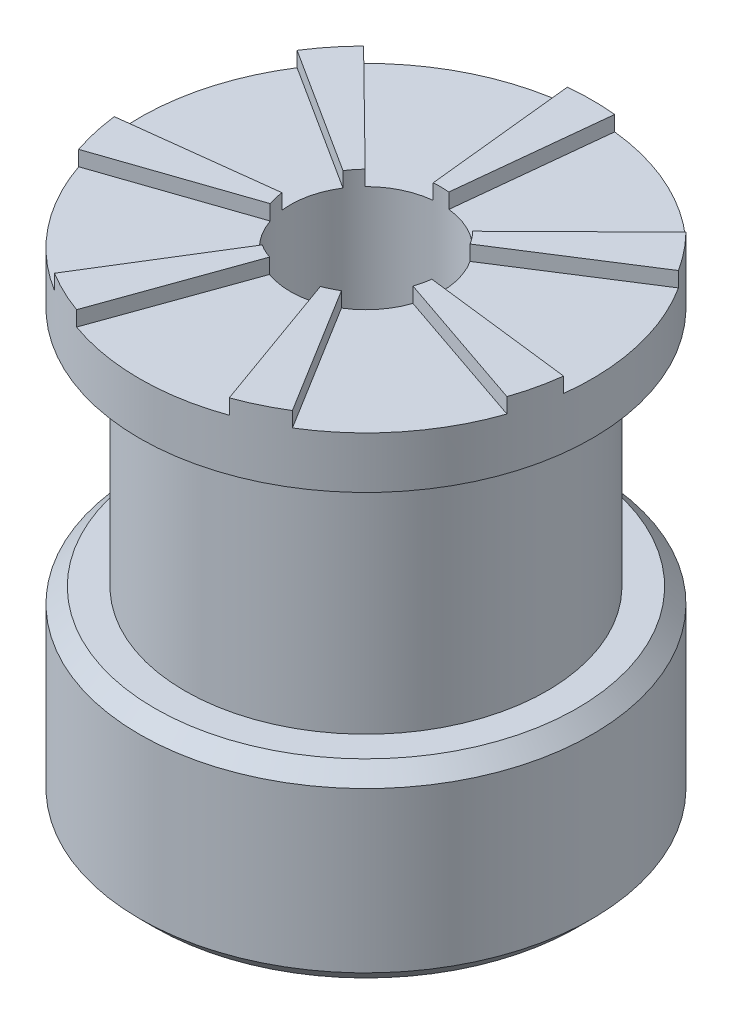
ISO-10303-21;
HEADER;
FILE_DESCRIPTION(('STEP AP214'),'2;1');
FILE_NAME('part.step','',(''),(''),'','','');
FILE_SCHEMA(('AUTOMOTIVE_DESIGN { 1 0 10303 214 1 1 1 1 }'));
ENDSEC;
DATA;
#1=APPLICATION_CONTEXT('core data for automotive mechanical design processes');
#2=APPLICATION_PROTOCOL_DEFINITION('international standard','automotive_design',2000,#1);
#3=PRODUCT_CONTEXT('',#1,'mechanical');
#4=PRODUCT('Part','Part','',(#3));
#5=PRODUCT_RELATED_PRODUCT_CATEGORY('part','',(#4));
#6=PRODUCT_DEFINITION_FORMATION('','',#4);
#7=PRODUCT_DEFINITION_CONTEXT('part definition',#1,'design');
#8=PRODUCT_DEFINITION('design','',#6,#7);
#9=PRODUCT_DEFINITION_SHAPE('','',#8);
#10=(LENGTH_UNIT() NAMED_UNIT(*) SI_UNIT(.MILLI.,.METRE.));
#11=(NAMED_UNIT(*) PLANE_ANGLE_UNIT() SI_UNIT($,.RADIAN.));
#12=(NAMED_UNIT(*) SI_UNIT($,.STERADIAN.) SOLID_ANGLE_UNIT());
#13=UNCERTAINTY_MEASURE_WITH_UNIT(LENGTH_MEASURE(1.E-05),#10,'distance_accuracy_value','');
#14=(GEOMETRIC_REPRESENTATION_CONTEXT(3) GLOBAL_UNCERTAINTY_ASSIGNED_CONTEXT((#13)) GLOBAL_UNIT_ASSIGNED_CONTEXT((#10,
#11,#12)) REPRESENTATION_CONTEXT('',''));
#15=CARTESIAN_POINT('',(0.,0.,0.));
#16=DIRECTION('',(0.,0.,1.));
#17=DIRECTION('',(1.,0.,0.));
#18=AXIS2_PLACEMENT_3D('',#15,#16,#17);
#19=CARTESIAN_POINT('',(0.,16.,0.));
#20=DIRECTION('',(0.,1.,0.));
#21=DIRECTION('',(0.,0.,1.));
#22=AXIS2_PLACEMENT_3D('',#19,#20,#21);
#23=PLANE('',#22);
#24=CARTESIAN_POINT('',(0.,16.,0.));
#25=DIRECTION('',(0.,1.,0.));
#26=DIRECTION('',(0.,0.,1.));
#27=AXIS2_PLACEMENT_3D('',#24,#25,#26);
#28=CIRCLE('',#27,2.5);
#29=CARTESIAN_POINT('',(1.78094024237836,16.,-1.75449475720998));
#30=VERTEX_POINT('',#29);
#31=CARTESIAN_POINT('',(0.261321158169134,16.,-2.48630473842068));
#32=VERTEX_POINT('',#31);
#33=EDGE_CURVE('E470',#30,#32,#28,.T.);
#34=ORIENTED_EDGE('',*,*,#33,.F.);
#35=DIRECTION('',(-0.712376096951347,0.,0.701797902883989));
#36=VECTOR('',#35,1.);
#37=CARTESIAN_POINT('',(0.,16.,0.));
#38=LINE('',#37,#36);
#39=CARTESIAN_POINT('',(5.3428207271351,16.,-5.26348427162992));
#40=VERTEX_POINT('',#39);
#41=EDGE_CURVE('E307',#40,#30,#38,.T.);
#42=ORIENTED_EDGE('',*,*,#41,.F.);
#43=CARTESIAN_POINT('',(0.,16.,0.));
#44=DIRECTION('',(0.,1.,0.));
#45=DIRECTION('',(0.,0.,1.));
#46=AXIS2_PLACEMENT_3D('',#43,#44,#45);
#47=CIRCLE('',#46,7.5);
#48=CARTESIAN_POINT('',(0.783963474507402,16.,-7.45891421526205));
#49=VERTEX_POINT('',#48);
#50=EDGE_CURVE('E468',#40,#49,#47,.T.);
#51=ORIENTED_EDGE('',*,*,#50,.T.);
#52=DIRECTION('',(-0.104528463267654,0.,0.994521895368273));
#53=VECTOR('',#52,1.);
#54=CARTESIAN_POINT('',(0.,16.,0.));
#55=LINE('',#54,#53);
#56=EDGE_CURVE('E435',#49,#32,#55,.T.);
#57=ORIENTED_EDGE('',*,*,#56,.T.);
#58=EDGE_LOOP('',(#34,#42,#51,#57));
#59=FACE_BOUND('',#58,.T.);
#60=ADVANCED_FACE('F94',(#59),#23,.T.);
#61=DIRECTION('',(-0.842720958654041,0.,0.53835061609068));
#62=VECTOR('',#61,1.);
#63=CARTESIAN_POINT('',(0.,16.,0.));
#64=LINE('',#63,#62);
#65=CARTESIAN_POINT('',(6.3204071899053,16.,-4.0376296206801));
#66=VERTEX_POINT('',#65);
#67=CARTESIAN_POINT('',(2.1068023966351,16.,-1.34587654022671));
#68=VERTEX_POINT('',#67);
#69=EDGE_CURVE('E288',#66,#68,#64,.T.);
#70=ORIENTED_EDGE('',*,*,#69,.T.);
#71=CARTESIAN_POINT('',(2.48211731585459,16.,0.298485561350611));
#72=VERTEX_POINT('',#71);
#73=EDGE_CURVE('E585',#72,#68,#28,.T.);
#74=ORIENTED_EDGE('',*,*,#73,.F.);
#75=DIRECTION('',(-0.992846926341837,0.,-0.11939422454025));
#76=VECTOR('',#75,1.);
#77=CARTESIAN_POINT('',(0.,16.,0.));
#78=LINE('',#77,#76);
#79=CARTESIAN_POINT('',(7.44635194756378,16.,0.89545668405186));
#80=VERTEX_POINT('',#79);
#81=EDGE_CURVE('E322',#80,#72,#78,.T.);
#82=ORIENTED_EDGE('',*,*,#81,.F.);
#83=EDGE_CURVE('E596',#80,#66,#47,.T.);
#84=ORIENTED_EDGE('',*,*,#83,.T.);
#85=EDGE_LOOP('',(#70,#74,#82,#84));
#86=FACE_BOUND('',#85,.T.);
#87=ADVANCED_FACE('F526',(#86),#23,.T.);
#88=DIRECTION('',(-0.946327383799164,0.,-0.323209657454461));
#89=VECTOR('',#88,1.);
#90=CARTESIAN_POINT('',(0.,16.,0.));
#91=LINE('',#90,#89);
#92=CARTESIAN_POINT('',(7.09745537849372,16.,2.42407243090848));
#93=VERTEX_POINT('',#92);
#94=CARTESIAN_POINT('',(2.3658184594979,16.,0.808024143636173));
#95=VERTEX_POINT('',#94);
#96=EDGE_CURVE('E292',#93,#95,#91,.T.);
#97=ORIENTED_EDGE('',*,*,#96,.T.);
#98=CARTESIAN_POINT('',(1.31420942452626,16.,2.12670016421835));
#99=VERTEX_POINT('',#98);
#100=EDGE_CURVE('E581',#99,#95,#28,.T.);
#101=ORIENTED_EDGE('',*,*,#100,.F.);
#102=DIRECTION('',(-0.525683769810498,0.,-0.850680065687344));
#103=VECTOR('',#102,1.);
#104=CARTESIAN_POINT('',(0.,16.,0.));
#105=LINE('',#104,#103);
#106=CARTESIAN_POINT('',(3.94262827357875,16.,6.38010049265507));
#107=VERTEX_POINT('',#106);
#108=EDGE_CURVE('E343',#107,#99,#105,.T.);
#109=ORIENTED_EDGE('',*,*,#108,.F.);
#110=EDGE_CURVE('E597',#107,#93,#47,.T.);
#111=ORIENTED_EDGE('',*,*,#110,.T.);
#112=EDGE_LOOP('',(#97,#101,#109,#111));
#113=FACE_BOUND('',#112,.T.);
#114=ADVANCED_FACE('F532',(#113),#23,.T.);
#115=DIRECTION('',(-0.337329987382822,0.,-0.941386466660906));
#116=VECTOR('',#115,1.);
#117=CARTESIAN_POINT('',(0.,16.,0.));
#118=LINE('',#117,#116);
#119=CARTESIAN_POINT('',(2.52997490537118,16.,7.06039849995679));
#120=VERTEX_POINT('',#119);
#121=CARTESIAN_POINT('',(0.843324968457075,16.,2.35346616665226));
#122=VERTEX_POINT('',#121);
#123=EDGE_CURVE('E338',#120,#122,#118,.T.);
#124=ORIENTED_EDGE('',*,*,#123,.T.);
#125=CARTESIAN_POINT('',(-0.843324968457075,16.,2.35346616665226));
#126=VERTEX_POINT('',#125);
#127=EDGE_CURVE('E577',#126,#122,#28,.T.);
#128=ORIENTED_EDGE('',*,*,#127,.F.);
#129=DIRECTION('',(0.337329987382841,0.,-0.941386466660899));
#130=VECTOR('',#129,1.);
#131=CARTESIAN_POINT('',(0.,16.,0.));
#132=LINE('',#131,#130);
#133=CARTESIAN_POINT('',(-2.52997490537128,16.,7.06039849995675));
#134=VERTEX_POINT('',#133);
#135=EDGE_CURVE('E366',#134,#126,#132,.T.);
#136=ORIENTED_EDGE('',*,*,#135,.F.);
#137=EDGE_CURVE('E600',#134,#120,#47,.T.);
#138=ORIENTED_EDGE('',*,*,#137,.T.);
#139=EDGE_LOOP('',(#124,#128,#136,#138));
#140=FACE_BOUND('',#139,.T.);
#141=ADVANCED_FACE('F638',(#140),#23,.T.);
#142=DIRECTION('',(0.525683769810515,0.,-0.850680065687333));
#143=VECTOR('',#142,1.);
#144=CARTESIAN_POINT('',(0.,16.,0.));
#145=LINE('',#144,#143);
#146=CARTESIAN_POINT('',(-3.94262827357884,16.,6.38010049265501));
#147=VERTEX_POINT('',#146);
#148=CARTESIAN_POINT('',(-1.31420942452626,16.,2.12670016421835));
#149=VERTEX_POINT('',#148);
#150=EDGE_CURVE('E361',#147,#149,#145,.T.);
#151=ORIENTED_EDGE('',*,*,#150,.T.);
#152=CARTESIAN_POINT('',(-2.36581845949791,16.,0.808024143636149));
#153=VERTEX_POINT('',#152);
#154=EDGE_CURVE('E575',#153,#149,#28,.T.);
#155=ORIENTED_EDGE('',*,*,#154,.F.);
#156=DIRECTION('',(0.946327383799169,0.,-0.323209657454447));
#157=VECTOR('',#156,1.);
#158=CARTESIAN_POINT('',(0.,16.,0.));
#159=LINE('',#158,#157);
#160=CARTESIAN_POINT('',(-7.09745537849375,16.,2.42407243090838));
#161=VERTEX_POINT('',#160);
#162=EDGE_CURVE('E389',#161,#153,#159,.T.);
#163=ORIENTED_EDGE('',*,*,#162,.F.);
#164=EDGE_CURVE('E605',#161,#147,#47,.T.);
#165=ORIENTED_EDGE('',*,*,#164,.T.);
#166=EDGE_LOOP('',(#151,#155,#163,#165));
#167=FACE_BOUND('',#166,.T.);
#168=ADVANCED_FACE('F544',(#167),#23,.T.);
#169=DIRECTION('',(0.992846926341838,0.,-0.119394224540235));
#170=VECTOR('',#169,1.);
#171=CARTESIAN_POINT('',(0.,16.,0.));
#172=LINE('',#171,#170);
#173=CARTESIAN_POINT('',(-7.44635194756379,16.,0.89545668405176));
#174=VERTEX_POINT('',#173);
#175=CARTESIAN_POINT('',(-2.4821173158546,16.,0.298485561350587));
#176=VERTEX_POINT('',#175);
#177=EDGE_CURVE('E384',#174,#176,#172,.T.);
#178=ORIENTED_EDGE('',*,*,#177,.T.);
#179=CARTESIAN_POINT('',(-2.1068023966351,16.,-1.34587654022671));
#180=VERTEX_POINT('',#179);
#181=EDGE_CURVE('E469',#180,#176,#28,.T.);
#182=ORIENTED_EDGE('',*,*,#181,.F.);
#183=DIRECTION('',(0.842720958654029,0.,0.538350616090698));
#184=VECTOR('',#183,1.);
#185=CARTESIAN_POINT('',(0.,16.,0.));
#186=LINE('',#185,#184);
#187=CARTESIAN_POINT('',(-6.32040718990524,16.,-4.0376296206802));
#188=VERTEX_POINT('',#187);
#189=EDGE_CURVE('E412',#188,#180,#186,.T.);
#190=ORIENTED_EDGE('',*,*,#189,.F.);
#191=EDGE_CURVE('E478',#188,#174,#47,.T.);
#192=ORIENTED_EDGE('',*,*,#191,.T.);
#193=EDGE_LOOP('',(#178,#182,#190,#192));
#194=FACE_BOUND('',#193,.T.);
#195=ADVANCED_FACE('F538',(#194),#23,.T.);
#196=DIRECTION('',(0.712376096951332,0.,0.701797902884004));
#197=VECTOR('',#196,1.);
#198=CARTESIAN_POINT('',(0.,16.,0.));
#199=LINE('',#198,#197);
#200=CARTESIAN_POINT('',(-5.34282072713502,16.,-5.26348427163));
#201=VERTEX_POINT('',#200);
#202=CARTESIAN_POINT('',(-1.78094024237836,16.,-1.75449475720998));
#203=VERTEX_POINT('',#202);
#204=EDGE_CURVE('E407',#201,#203,#199,.T.);
#205=ORIENTED_EDGE('',*,*,#204,.T.);
#206=CARTESIAN_POINT('',(-0.261321158169134,16.,-2.48630473842068));
#207=VERTEX_POINT('',#206);
#208=EDGE_CURVE('E465',#207,#203,#28,.T.);
#209=ORIENTED_EDGE('',*,*,#208,.F.);
#210=DIRECTION('',(0.104528463267654,0.,0.994521895368273));
#211=VECTOR('',#210,1.);
#212=CARTESIAN_POINT('',(0.,16.,0.));
#213=LINE('',#212,#211);
#214=CARTESIAN_POINT('',(-0.783963474507402,16.,-7.45891421526205));
#215=VERTEX_POINT('',#214);
#216=EDGE_CURVE('E430',#215,#207,#213,.T.);
#217=ORIENTED_EDGE('',*,*,#216,.F.);
#218=EDGE_CURVE('E474',#215,#201,#47,.T.);
#219=ORIENTED_EDGE('',*,*,#218,.T.);
#220=EDGE_LOOP('',(#205,#209,#217,#219));
#221=FACE_BOUND('',#220,.T.);
#222=ADVANCED_FACE('F500',(#221),#23,.T.);
#223=CARTESIAN_POINT('',(0.,16.,0.));
#224=DIRECTION('',(0.,-1.,0.));
#225=DIRECTION('',(0.,0.,-1.));
#226=AXIS2_PLACEMENT_3D('',#223,#224,#225);
#227=CYLINDRICAL_SURFACE('',#226,7.5);
#228=CARTESIAN_POINT('',(0.,0.5,0.));
#229=DIRECTION('',(0.,1.,0.));
#230=DIRECTION('',(0.,0.,1.));
#231=AXIS2_PLACEMENT_3D('',#228,#229,#230);
#232=CIRCLE('',#231,7.5);
#233=CARTESIAN_POINT('',(0.,0.5,7.5));
#234=VERTEX_POINT('',#233);
#235=EDGE_CURVE('E483',#234,#234,#232,.T.);
#236=ORIENTED_EDGE('',*,*,#235,.T.);
#237=EDGE_LOOP('',(#236));
#238=FACE_BOUND('',#237,.T.);
#239=CARTESIAN_POINT('',(0.,5.79,0.));
#240=DIRECTION('',(0.,1.,0.));
#241=DIRECTION('',(0.,0.,1.));
#242=AXIS2_PLACEMENT_3D('',#239,#240,#241);
#243=CIRCLE('',#242,7.5);
#244=CARTESIAN_POINT('',(0.,5.79,7.5));
#245=VERTEX_POINT('',#244);
#246=EDGE_CURVE('E477',#245,#245,#243,.F.);
#247=ORIENTED_EDGE('',*,*,#246,.T.);
#248=EDGE_LOOP('',(#247));
#249=FACE_BOUND('',#248,.T.);
#250=ADVANCED_FACE('F497',(#238,#249),#227,.T.);
#251=CARTESIAN_POINT('',(0.,0.,0.));
#252=DIRECTION('',(0.,1.,0.));
#253=DIRECTION('',(0.,0.,1.));
#254=AXIS2_PLACEMENT_3D('',#251,#252,#253);
#255=PLANE('',#254);
#256=CARTESIAN_POINT('',(0.,0.,0.));
#257=DIRECTION('',(0.,1.,0.));
#258=DIRECTION('',(0.,0.,1.));
#259=AXIS2_PLACEMENT_3D('',#256,#257,#258);
#260=CIRCLE('',#259,7.);
#261=CARTESIAN_POINT('',(0.,0.,7.));
#262=VERTEX_POINT('',#261);
#263=EDGE_CURVE('E103',#262,#262,#260,.F.);
#264=ORIENTED_EDGE('',*,*,#263,.T.);
#265=EDGE_LOOP('',(#264));
#266=FACE_BOUND('',#265,.T.);
#267=CARTESIAN_POINT('',(0.,0.,0.));
#268=DIRECTION('',(0.,1.,0.));
#269=DIRECTION('',(0.,0.,1.));
#270=AXIS2_PLACEMENT_3D('',#267,#268,#269);
#271=CIRCLE('',#270,2.5);
#272=CARTESIAN_POINT('',(0.,0.,2.5));
#273=VERTEX_POINT('',#272);
#274=EDGE_CURVE('E471',#273,#273,#271,.T.);
#275=ORIENTED_EDGE('',*,*,#274,.T.);
#276=EDGE_LOOP('',(#275));
#277=FACE_BOUND('',#276,.T.);
#278=ADVANCED_FACE('F488',(#266,#277),#255,.F.);
#279=CARTESIAN_POINT('',(0.,14.29,0.));
#280=DIRECTION('',(0.,1.,0.));
#281=DIRECTION('',(0.,0.,1.));
#282=AXIS2_PLACEMENT_3D('',#279,#280,#281);
#283=CIRCLE('',#282,7.5);
#284=CARTESIAN_POINT('',(0.,14.29,7.5));
#285=VERTEX_POINT('',#284);
#286=EDGE_CURVE('E462',#285,#285,#283,.T.);
#287=ORIENTED_EDGE('',*,*,#286,.T.);
#288=EDGE_LOOP('',(#287));
#289=FACE_BOUND('',#288,.T.);
#290=ORIENTED_EDGE('',*,*,#218,.F.);
#291=DIRECTION('',(0.,-1.,0.));
#292=VECTOR('',#291,1.);
#293=CARTESIAN_POINT('',(-0.783963474507402,16.5,-7.45891421526205));
#294=LINE('',#293,#292);
#295=CARTESIAN_POINT('',(-0.783963474507402,16.5,-7.45891421526205));
#296=VERTEX_POINT('',#295);
#297=EDGE_CURVE('E455',#296,#215,#294,.T.);
#298=ORIENTED_EDGE('',*,*,#297,.F.);
#299=CARTESIAN_POINT('',(0.,16.5,0.));
#300=DIRECTION('',(0.,1.,0.));
#301=DIRECTION('',(0.,0.,1.));
#302=AXIS2_PLACEMENT_3D('',#299,#300,#301);
#303=CIRCLE('',#302,7.5);
#304=CARTESIAN_POINT('',(0.783963474507402,16.5,-7.45891421526205));
#305=VERTEX_POINT('',#304);
#306=EDGE_CURVE('E431',#305,#296,#303,.T.);
#307=ORIENTED_EDGE('',*,*,#306,.F.);
#308=DIRECTION('',(0.,-1.,0.));
#309=VECTOR('',#308,1.);
#310=CARTESIAN_POINT('',(0.783963474507402,16.5,-7.45891421526205));
#311=LINE('',#310,#309);
#312=EDGE_CURVE('E442',#305,#49,#311,.T.);
#313=ORIENTED_EDGE('',*,*,#312,.T.);
#314=ORIENTED_EDGE('',*,*,#50,.F.);
#315=DIRECTION('',(0.,-1.,0.));
#316=VECTOR('',#315,1.);
#317=CARTESIAN_POINT('',(5.3428207271351,16.5,-5.26348427162992));
#318=LINE('',#317,#316);
#319=CARTESIAN_POINT('',(5.3428207271351,16.5,-5.26348427162992));
#320=VERTEX_POINT('',#319);
#321=EDGE_CURVE('E293',#320,#40,#318,.T.);
#322=ORIENTED_EDGE('',*,*,#321,.F.);
#323=CARTESIAN_POINT('',(0.,16.5,0.));
#324=DIRECTION('',(0.,1.,0.));
#325=DIRECTION('',(0.,0.,1.));
#326=AXIS2_PLACEMENT_3D('',#323,#324,#325);
#327=CIRCLE('',#326,7.5);
#328=CARTESIAN_POINT('',(6.3204071899053,16.5,-4.0376296206801));
#329=VERTEX_POINT('',#328);
#330=EDGE_CURVE('E296',#329,#320,#327,.T.);
#331=ORIENTED_EDGE('',*,*,#330,.F.);
#332=DIRECTION('',(0.,-1.,0.));
#333=VECTOR('',#332,1.);
#334=CARTESIAN_POINT('',(6.3204071899053,16.5,-4.0376296206801));
#335=LINE('',#334,#333);
#336=EDGE_CURVE('E282',#329,#66,#335,.T.);
#337=ORIENTED_EDGE('',*,*,#336,.T.);
#338=ORIENTED_EDGE('',*,*,#83,.F.);
#339=DIRECTION('',(0.,-1.,0.));
#340=VECTOR('',#339,1.);
#341=CARTESIAN_POINT('',(7.44635194756378,16.5,0.89545668405186));
#342=LINE('',#341,#340);
#343=CARTESIAN_POINT('',(7.44635194756378,16.5,0.89545668405186));
#344=VERTEX_POINT('',#343);
#345=EDGE_CURVE('E334',#344,#80,#342,.T.);
#346=ORIENTED_EDGE('',*,*,#345,.F.);
#347=CARTESIAN_POINT('',(0.,16.5,0.));
#348=DIRECTION('',(0.,1.,0.));
#349=DIRECTION('',(0.,0.,1.));
#350=AXIS2_PLACEMENT_3D('',#347,#348,#349);
#351=CIRCLE('',#350,7.5);
#352=CARTESIAN_POINT('',(7.09745537849372,16.5,2.42407243090848));
#353=VERTEX_POINT('',#352);
#354=EDGE_CURVE('E321',#353,#344,#351,.T.);
#355=ORIENTED_EDGE('',*,*,#354,.F.);
#356=DIRECTION('',(0.,-1.,0.));
#357=VECTOR('',#356,1.);
#358=CARTESIAN_POINT('',(7.09745537849372,16.5,2.42407243090848));
#359=LINE('',#358,#357);
#360=EDGE_CURVE('E336',#353,#93,#359,.T.);
#361=ORIENTED_EDGE('',*,*,#360,.T.);
#362=ORIENTED_EDGE('',*,*,#110,.F.);
#363=DIRECTION('',(0.,-1.,0.));
#364=VECTOR('',#363,1.);
#365=CARTESIAN_POINT('',(3.94262827357875,16.5,6.38010049265507));
#366=LINE('',#365,#364);
#367=CARTESIAN_POINT('',(3.94262827357875,16.5,6.38010049265507));
#368=VERTEX_POINT('',#367);
#369=EDGE_CURVE('E357',#368,#107,#366,.T.);
#370=ORIENTED_EDGE('',*,*,#369,.F.);
#371=CARTESIAN_POINT('',(0.,16.5,0.));
#372=DIRECTION('',(0.,1.,0.));
#373=DIRECTION('',(0.,0.,1.));
#374=AXIS2_PLACEMENT_3D('',#371,#372,#373);
#375=CIRCLE('',#374,7.5);
#376=CARTESIAN_POINT('',(2.52997490537118,16.5,7.06039849995679));
#377=VERTEX_POINT('',#376);
#378=EDGE_CURVE('E342',#377,#368,#375,.T.);
#379=ORIENTED_EDGE('',*,*,#378,.F.);
#380=DIRECTION('',(0.,-1.,0.));
#381=VECTOR('',#380,1.);
#382=CARTESIAN_POINT('',(2.52997490537118,16.5,7.06039849995679));
#383=LINE('',#382,#381);
#384=EDGE_CURVE('E359',#377,#120,#383,.T.);
#385=ORIENTED_EDGE('',*,*,#384,.T.);
#386=ORIENTED_EDGE('',*,*,#137,.F.);
#387=DIRECTION('',(0.,-1.,0.));
#388=VECTOR('',#387,1.);
#389=CARTESIAN_POINT('',(-2.52997490537128,16.5,7.06039849995675));
#390=LINE('',#389,#388);
#391=CARTESIAN_POINT('',(-2.52997490537128,16.5,7.06039849995675));
#392=VERTEX_POINT('',#391);
#393=EDGE_CURVE('E380',#392,#134,#390,.T.);
#394=ORIENTED_EDGE('',*,*,#393,.F.);
#395=CARTESIAN_POINT('',(0.,16.5,0.));
#396=DIRECTION('',(0.,1.,0.));
#397=DIRECTION('',(0.,0.,1.));
#398=AXIS2_PLACEMENT_3D('',#395,#396,#397);
#399=CIRCLE('',#398,7.5);
#400=CARTESIAN_POINT('',(-3.94262827357884,16.5,6.38010049265501));
#401=VERTEX_POINT('',#400);
#402=EDGE_CURVE('E365',#401,#392,#399,.T.);
#403=ORIENTED_EDGE('',*,*,#402,.F.);
#404=DIRECTION('',(0.,-1.,0.));
#405=VECTOR('',#404,1.);
#406=CARTESIAN_POINT('',(-3.94262827357884,16.5,6.38010049265501));
#407=LINE('',#406,#405);
#408=EDGE_CURVE('E382',#401,#147,#407,.T.);
#409=ORIENTED_EDGE('',*,*,#408,.T.);
#410=ORIENTED_EDGE('',*,*,#164,.F.);
#411=DIRECTION('',(0.,-1.,0.));
#412=VECTOR('',#411,1.);
#413=CARTESIAN_POINT('',(-7.09745537849375,16.5,2.42407243090838));
#414=LINE('',#413,#412);
#415=CARTESIAN_POINT('',(-7.09745537849375,16.5,2.42407243090838));
#416=VERTEX_POINT('',#415);
#417=EDGE_CURVE('E403',#416,#161,#414,.T.);
#418=ORIENTED_EDGE('',*,*,#417,.F.);
#419=CARTESIAN_POINT('',(0.,16.5,0.));
#420=DIRECTION('',(0.,1.,0.));
#421=DIRECTION('',(0.,0.,1.));
#422=AXIS2_PLACEMENT_3D('',#419,#420,#421);
#423=CIRCLE('',#422,7.5);
#424=CARTESIAN_POINT('',(-7.44635194756379,16.5,0.89545668405176));
#425=VERTEX_POINT('',#424);
#426=EDGE_CURVE('E388',#425,#416,#423,.T.);
#427=ORIENTED_EDGE('',*,*,#426,.F.);
#428=DIRECTION('',(0.,-1.,0.));
#429=VECTOR('',#428,1.);
#430=CARTESIAN_POINT('',(-7.44635194756379,16.5,0.89545668405176));
#431=LINE('',#430,#429);
#432=EDGE_CURVE('E405',#425,#174,#431,.T.);
#433=ORIENTED_EDGE('',*,*,#432,.T.);
#434=ORIENTED_EDGE('',*,*,#191,.F.);
#435=DIRECTION('',(0.,-1.,0.));
#436=VECTOR('',#435,1.);
#437=CARTESIAN_POINT('',(-6.32040718990524,16.5,-4.0376296206802));
#438=LINE('',#437,#436);
#439=CARTESIAN_POINT('',(-6.32040718990524,16.5,-4.0376296206802));
#440=VERTEX_POINT('',#439);
#441=EDGE_CURVE('E426',#440,#188,#438,.T.);
#442=ORIENTED_EDGE('',*,*,#441,.F.);
#443=CARTESIAN_POINT('',(0.,16.5,0.));
#444=DIRECTION('',(0.,1.,0.));
#445=DIRECTION('',(0.,0.,1.));
#446=AXIS2_PLACEMENT_3D('',#443,#444,#445);
#447=CIRCLE('',#446,7.5);
#448=CARTESIAN_POINT('',(-5.34282072713502,16.5,-5.26348427163));
#449=VERTEX_POINT('',#448);
#450=EDGE_CURVE('E411',#449,#440,#447,.T.);
#451=ORIENTED_EDGE('',*,*,#450,.F.);
#452=DIRECTION('',(0.,-1.,0.));
#453=VECTOR('',#452,1.);
#454=CARTESIAN_POINT('',(-5.34282072713502,16.5,-5.26348427163));
#455=LINE('',#454,#453);
#456=EDGE_CURVE('E428',#449,#201,#455,.T.);
#457=ORIENTED_EDGE('',*,*,#456,.T.);
#458=EDGE_LOOP('',(#290,#298,#307,#313,#314,#322,#331,#337,#338,#346,#355,#361,#362,#370,#379,
#385,#386,#394,#403,#409,#410,#418,#427,#433,#434,#442,#451,#457));
#459=FACE_BOUND('',#458,.T.);
#460=ADVANCED_FACE('F298',(#289,#459),#227,.T.);
#461=CARTESIAN_POINT('',(0.,16.,0.));
#462=DIRECTION('',(0.,-1.,0.));
#463=DIRECTION('',(0.,0.,-1.));
#464=AXIS2_PLACEMENT_3D('',#461,#462,#463);
#465=CYLINDRICAL_SURFACE('',#464,2.5);
#466=ORIENTED_EDGE('',*,*,#208,.T.);
#467=DIRECTION('',(0.,-1.,0.));
#468=VECTOR('',#467,1.);
#469=CARTESIAN_POINT('',(-1.78094024237836,16.5,-1.75449475720998));
#470=LINE('',#469,#468);
#471=CARTESIAN_POINT('',(-1.78094024237836,16.5,-1.75449475720998));
#472=VERTEX_POINT('',#471);
#473=EDGE_CURVE('E418',#472,#203,#470,.T.);
#474=ORIENTED_EDGE('',*,*,#473,.F.);
#475=CARTESIAN_POINT('',(0.,16.5,0.));
#476=DIRECTION('',(0.,1.,0.));
#477=DIRECTION('',(0.,0.,1.));
#478=AXIS2_PLACEMENT_3D('',#475,#476,#477);
#479=CIRCLE('',#478,2.5);
#480=CARTESIAN_POINT('',(-2.1068023966351,16.5,-1.34587654022671));
#481=VERTEX_POINT('',#480);
#482=EDGE_CURVE('E416',#481,#472,#479,.F.);
#483=ORIENTED_EDGE('',*,*,#482,.F.);
#484=DIRECTION('',(0.,-1.,0.));
#485=VECTOR('',#484,1.);
#486=CARTESIAN_POINT('',(-2.1068023966351,16.5,-1.34587654022671));
#487=LINE('',#486,#485);
#488=EDGE_CURVE('E424',#481,#180,#487,.T.);
#489=ORIENTED_EDGE('',*,*,#488,.T.);
#490=ORIENTED_EDGE('',*,*,#181,.T.);
#491=DIRECTION('',(0.,-1.,0.));
#492=VECTOR('',#491,1.);
#493=CARTESIAN_POINT('',(-2.4821173158546,16.5,0.298485561350587));
#494=LINE('',#493,#492);
#495=CARTESIAN_POINT('',(-2.4821173158546,16.5,0.298485561350587));
#496=VERTEX_POINT('',#495);
#497=EDGE_CURVE('E395',#496,#176,#494,.T.);
#498=ORIENTED_EDGE('',*,*,#497,.F.);
#499=CARTESIAN_POINT('',(0.,16.5,0.));
#500=DIRECTION('',(0.,1.,0.));
#501=DIRECTION('',(0.,0.,1.));
#502=AXIS2_PLACEMENT_3D('',#499,#500,#501);
#503=CIRCLE('',#502,2.5);
#504=CARTESIAN_POINT('',(-2.36581845949791,16.5,0.808024143636149));
#505=VERTEX_POINT('',#504);
#506=EDGE_CURVE('E393',#505,#496,#503,.F.);
#507=ORIENTED_EDGE('',*,*,#506,.F.);
#508=DIRECTION('',(0.,-1.,0.));
#509=VECTOR('',#508,1.);
#510=CARTESIAN_POINT('',(-2.36581845949791,16.5,0.808024143636149));
#511=LINE('',#510,#509);
#512=EDGE_CURVE('E401',#505,#153,#511,.T.);
#513=ORIENTED_EDGE('',*,*,#512,.T.);
#514=ORIENTED_EDGE('',*,*,#154,.T.);
#515=DIRECTION('',(0.,-1.,0.));
#516=VECTOR('',#515,1.);
#517=CARTESIAN_POINT('',(-1.31420942452626,16.5,2.12670016421835));
#518=LINE('',#517,#516);
#519=CARTESIAN_POINT('',(-1.31420942452626,16.5,2.12670016421835));
#520=VERTEX_POINT('',#519);
#521=EDGE_CURVE('E372',#520,#149,#518,.T.);
#522=ORIENTED_EDGE('',*,*,#521,.F.);
#523=CARTESIAN_POINT('',(0.,16.5,0.));
#524=DIRECTION('',(0.,1.,0.));
#525=DIRECTION('',(0.,0.,1.));
#526=AXIS2_PLACEMENT_3D('',#523,#524,#525);
#527=CIRCLE('',#526,2.5);
#528=CARTESIAN_POINT('',(-0.843324968457075,16.5,2.35346616665226));
#529=VERTEX_POINT('',#528);
#530=EDGE_CURVE('E370',#529,#520,#527,.F.);
#531=ORIENTED_EDGE('',*,*,#530,.F.);
#532=DIRECTION('',(0.,-1.,0.));
#533=VECTOR('',#532,1.);
#534=CARTESIAN_POINT('',(-0.843324968457075,16.5,2.35346616665226));
#535=LINE('',#534,#533);
#536=EDGE_CURVE('E378',#529,#126,#535,.T.);
#537=ORIENTED_EDGE('',*,*,#536,.T.);
#538=ORIENTED_EDGE('',*,*,#127,.T.);
#539=DIRECTION('',(0.,-1.,0.));
#540=VECTOR('',#539,1.);
#541=CARTESIAN_POINT('',(0.843324968457075,16.5,2.35346616665226));
#542=LINE('',#541,#540);
#543=CARTESIAN_POINT('',(0.843324968457075,16.5,2.35346616665226));
#544=VERTEX_POINT('',#543);
#545=EDGE_CURVE('E349',#544,#122,#542,.T.);
#546=ORIENTED_EDGE('',*,*,#545,.F.);
#547=CARTESIAN_POINT('',(0.,16.5,0.));
#548=DIRECTION('',(0.,1.,0.));
#549=DIRECTION('',(0.,0.,1.));
#550=AXIS2_PLACEMENT_3D('',#547,#548,#549);
#551=CIRCLE('',#550,2.5);
#552=CARTESIAN_POINT('',(1.31420942452626,16.5,2.12670016421835));
#553=VERTEX_POINT('',#552);
#554=EDGE_CURVE('E347',#553,#544,#551,.F.);
#555=ORIENTED_EDGE('',*,*,#554,.F.);
#556=DIRECTION('',(0.,-1.,0.));
#557=VECTOR('',#556,1.);
#558=CARTESIAN_POINT('',(1.31420942452626,16.5,2.12670016421835));
#559=LINE('',#558,#557);
#560=EDGE_CURVE('E355',#553,#99,#559,.T.);
#561=ORIENTED_EDGE('',*,*,#560,.T.);
#562=ORIENTED_EDGE('',*,*,#100,.T.);
#563=DIRECTION('',(0.,-1.,0.));
#564=VECTOR('',#563,1.);
#565=CARTESIAN_POINT('',(2.3658184594979,16.5,0.808024143636173));
#566=LINE('',#565,#564);
#567=CARTESIAN_POINT('',(2.3658184594979,16.5,0.808024143636173));
#568=VERTEX_POINT('',#567);
#569=EDGE_CURVE('E328',#568,#95,#566,.T.);
#570=ORIENTED_EDGE('',*,*,#569,.F.);
#571=CARTESIAN_POINT('',(0.,16.5,0.));
#572=DIRECTION('',(0.,1.,0.));
#573=DIRECTION('',(0.,0.,1.));
#574=AXIS2_PLACEMENT_3D('',#571,#572,#573);
#575=CIRCLE('',#574,2.5);
#576=CARTESIAN_POINT('',(2.48211731585459,16.5,0.298485561350611));
#577=VERTEX_POINT('',#576);
#578=EDGE_CURVE('E326',#577,#568,#575,.F.);
#579=ORIENTED_EDGE('',*,*,#578,.F.);
#580=DIRECTION('',(0.,-1.,0.));
#581=VECTOR('',#580,1.);
#582=CARTESIAN_POINT('',(2.48211731585459,16.5,0.298485561350611));
#583=LINE('',#582,#581);
#584=EDGE_CURVE('E117',#577,#72,#583,.T.);
#585=ORIENTED_EDGE('',*,*,#584,.T.);
#586=ORIENTED_EDGE('',*,*,#73,.T.);
#587=DIRECTION('',(0.,-1.,0.));
#588=VECTOR('',#587,1.);
#589=CARTESIAN_POINT('',(2.1068023966351,16.5,-1.34587654022671));
#590=LINE('',#589,#588);
#591=CARTESIAN_POINT('',(2.1068023966351,16.5,-1.34587654022671));
#592=VERTEX_POINT('',#591);
#593=EDGE_CURVE('E313',#592,#68,#590,.T.);
#594=ORIENTED_EDGE('',*,*,#593,.F.);
#595=CARTESIAN_POINT('',(0.,16.5,0.));
#596=DIRECTION('',(0.,1.,0.));
#597=DIRECTION('',(0.,0.,1.));
#598=AXIS2_PLACEMENT_3D('',#595,#596,#597);
#599=CIRCLE('',#598,2.5);
#600=CARTESIAN_POINT('',(1.78094024237836,16.5,-1.75449475720998));
#601=VERTEX_POINT('',#600);
#602=EDGE_CURVE('E305',#601,#592,#599,.F.);
#603=ORIENTED_EDGE('',*,*,#602,.F.);
#604=DIRECTION('',(0.,-1.,0.));
#605=VECTOR('',#604,1.);
#606=CARTESIAN_POINT('',(1.78094024237836,16.5,-1.75449475720998));
#607=LINE('',#606,#605);
#608=EDGE_CURVE('E110',#601,#30,#607,.T.);
#609=ORIENTED_EDGE('',*,*,#608,.T.);
#610=ORIENTED_EDGE('',*,*,#33,.T.);
#611=DIRECTION('',(0.,-1.,0.));
#612=VECTOR('',#611,1.);
#613=CARTESIAN_POINT('',(0.261321158169134,16.5,-2.48630473842068));
#614=LINE('',#613,#612);
#615=CARTESIAN_POINT('',(0.261321158169134,16.5,-2.48630473842068));
#616=VERTEX_POINT('',#615);
#617=EDGE_CURVE('E449',#616,#32,#614,.T.);
#618=ORIENTED_EDGE('',*,*,#617,.F.);
#619=CARTESIAN_POINT('',(0.,16.5,0.));
#620=DIRECTION('',(0.,1.,0.));
#621=DIRECTION('',(0.,0.,1.));
#622=AXIS2_PLACEMENT_3D('',#619,#620,#621);
#623=CIRCLE('',#622,2.5);
#624=CARTESIAN_POINT('',(-0.261321158169134,16.5,-2.48630473842068));
#625=VERTEX_POINT('',#624);
#626=EDGE_CURVE('E437',#625,#616,#623,.F.);
#627=ORIENTED_EDGE('',*,*,#626,.F.);
#628=DIRECTION('',(0.,-1.,0.));
#629=VECTOR('',#628,1.);
#630=CARTESIAN_POINT('',(-0.261321158169134,16.5,-2.48630473842068));
#631=LINE('',#630,#629);
#632=EDGE_CURVE('E452',#625,#207,#631,.T.);
#633=ORIENTED_EDGE('',*,*,#632,.T.);
#634=EDGE_LOOP('',(#466,#474,#483,#489,#490,#498,#507,#513,#514,#522,#531,#537,#538,#546,#555,
#561,#562,#570,#579,#585,#586,#594,#603,#609,#610,#618,#627,#633));
#635=FACE_BOUND('',#634,.T.);
#636=ORIENTED_EDGE('',*,*,#274,.F.);
#637=EDGE_LOOP('',(#636));
#638=FACE_BOUND('',#637,.T.);
#639=ADVANCED_FACE('F549',(#635,#638),#465,.F.);
#640=CARTESIAN_POINT('',(0.,14.29,0.));
#641=DIRECTION('',(0.,1.,0.));
#642=DIRECTION('',(0.,0.,1.));
#643=AXIS2_PLACEMENT_3D('',#640,#641,#642);
#644=PLANE('',#643);
#645=CARTESIAN_POINT('',(0.,14.29,0.));
#646=DIRECTION('',(0.,1.,0.));
#647=DIRECTION('',(0.,0.,1.));
#648=AXIS2_PLACEMENT_3D('',#645,#646,#647);
#649=CIRCLE('',#648,6.);
#650=CARTESIAN_POINT('',(0.,14.29,6.));
#651=VERTEX_POINT('',#650);
#652=EDGE_CURVE('E459',#651,#651,#649,.T.);
#653=ORIENTED_EDGE('',*,*,#652,.T.);
#654=EDGE_LOOP('',(#653));
#655=FACE_BOUND('',#654,.T.);
#656=ORIENTED_EDGE('',*,*,#286,.F.);
#657=EDGE_LOOP('',(#656));
#658=FACE_BOUND('',#657,.T.);
#659=ADVANCED_FACE('F512',(#655,#658),#644,.F.);
#660=CARTESIAN_POINT('',(0.,6.29,0.));
#661=DIRECTION('',(0.,1.,0.));
#662=DIRECTION('',(0.,0.,1.));
#663=AXIS2_PLACEMENT_3D('',#660,#661,#662);
#664=PLANE('',#663);
#665=CARTESIAN_POINT('',(0.,6.29,0.));
#666=DIRECTION('',(0.,1.,0.));
#667=DIRECTION('',(0.,0.,1.));
#668=AXIS2_PLACEMENT_3D('',#665,#666,#667);
#669=CIRCLE('',#668,7.);
#670=CARTESIAN_POINT('',(0.,6.29,7.));
#671=VERTEX_POINT('',#670);
#672=EDGE_CURVE('E13',#671,#671,#669,.T.);
#673=ORIENTED_EDGE('',*,*,#672,.T.);
#674=EDGE_LOOP('',(#673));
#675=FACE_BOUND('',#674,.T.);
#676=CARTESIAN_POINT('',(0.,6.29,0.));
#677=DIRECTION('',(0.,1.,0.));
#678=DIRECTION('',(0.,0.,1.));
#679=AXIS2_PLACEMENT_3D('',#676,#677,#678);
#680=CIRCLE('',#679,6.);
#681=CARTESIAN_POINT('',(0.,6.29,6.));
#682=VERTEX_POINT('',#681);
#683=EDGE_CURVE('E458',#682,#682,#680,.T.);
#684=ORIENTED_EDGE('',*,*,#683,.F.);
#685=EDGE_LOOP('',(#684));
#686=FACE_BOUND('',#685,.T.);
#687=ADVANCED_FACE('F509',(#675,#686),#664,.T.);
#688=CARTESIAN_POINT('',(0.,14.29,0.));
#689=DIRECTION('',(0.,-1.,0.));
#690=DIRECTION('',(0.,0.,-1.));
#691=AXIS2_PLACEMENT_3D('',#688,#689,#690);
#692=CYLINDRICAL_SURFACE('',#691,6.);
#693=ORIENTED_EDGE('',*,*,#652,.F.);
#694=EDGE_LOOP('',(#693));
#695=FACE_BOUND('',#694,.T.);
#696=ORIENTED_EDGE('',*,*,#683,.T.);
#697=EDGE_LOOP('',(#696));
#698=FACE_BOUND('',#697,.T.);
#699=ADVANCED_FACE('F494',(#695,#698),#692,.T.);
#700=CARTESIAN_POINT('',(0.,0.5,0.));
#701=DIRECTION('',(0.,1.,0.));
#702=DIRECTION('',(0.,0.,1.));
#703=AXIS2_PLACEMENT_3D('',#700,#701,#702);
#704=CONICAL_SURFACE('',#703,7.5,0.785398163397447);
#705=ORIENTED_EDGE('',*,*,#263,.F.);
#706=EDGE_LOOP('',(#705));
#707=FACE_BOUND('',#706,.T.);
#708=ORIENTED_EDGE('',*,*,#235,.F.);
#709=EDGE_LOOP('',(#708));
#710=FACE_BOUND('',#709,.T.);
#711=ADVANCED_FACE('F491',(#707,#710),#704,.T.);
#712=CARTESIAN_POINT('',(0.,6.29,0.));
#713=DIRECTION('',(0.,-1.,0.));
#714=DIRECTION('',(0.,0.,-1.));
#715=AXIS2_PLACEMENT_3D('',#712,#713,#714);
#716=CONICAL_SURFACE('',#715,7.,0.785398163397444);
#717=ORIENTED_EDGE('',*,*,#246,.F.);
#718=EDGE_LOOP('',(#717));
#719=FACE_BOUND('',#718,.T.);
#720=ORIENTED_EDGE('',*,*,#672,.F.);
#721=EDGE_LOOP('',(#720));
#722=FACE_BOUND('',#721,.T.);
#723=ADVANCED_FACE('F97',(#719,#722),#716,.T.);
#724=CARTESIAN_POINT('',(0.,16.5,0.));
#725=DIRECTION('',(0.994521895368273,0.,-0.104528463267654));
#726=DIRECTION('',(-0.104528463267654,0.,-0.994521895368273));
#727=AXIS2_PLACEMENT_3D('',#724,#725,#726);
#728=PLANE('',#727);
#729=ORIENTED_EDGE('',*,*,#216,.T.);
#730=ORIENTED_EDGE('',*,*,#632,.F.);
#731=DIRECTION('',(0.104528463267654,0.,0.994521895368273));
#732=VECTOR('',#731,1.);
#733=CARTESIAN_POINT('',(0.,16.5,0.));
#734=LINE('',#733,#732);
#735=EDGE_CURVE('E434',#296,#625,#734,.T.);
#736=ORIENTED_EDGE('',*,*,#735,.F.);
#737=ORIENTED_EDGE('',*,*,#297,.T.);
#738=EDGE_LOOP('',(#729,#730,#736,#737));
#739=FACE_BOUND('',#738,.T.);
#740=ADVANCED_FACE('F506',(#739),#728,.F.);
#741=CARTESIAN_POINT('',(0.,16.5,0.));
#742=DIRECTION('',(0.994521895368273,0.,0.104528463267654));
#743=DIRECTION('',(0.104528463267654,0.,-0.994521895368273));
#744=AXIS2_PLACEMENT_3D('',#741,#742,#743);
#745=PLANE('',#744);
#746=ORIENTED_EDGE('',*,*,#56,.F.);
#747=ORIENTED_EDGE('',*,*,#312,.F.);
#748=DIRECTION('',(-0.104528463267654,0.,0.994521895368273));
#749=VECTOR('',#748,1.);
#750=CARTESIAN_POINT('',(0.,16.5,0.));
#751=LINE('',#750,#749);
#752=EDGE_CURVE('E439',#305,#616,#751,.T.);
#753=ORIENTED_EDGE('',*,*,#752,.T.);
#754=ORIENTED_EDGE('',*,*,#617,.T.);
#755=EDGE_LOOP('',(#746,#747,#753,#754));
#756=FACE_BOUND('',#755,.T.);
#757=ADVANCED_FACE('F592',(#756),#745,.T.);
#758=CARTESIAN_POINT('',(0.,16.5,0.));
#759=DIRECTION('',(0.,1.,0.));
#760=DIRECTION('',(0.,0.,1.));
#761=AXIS2_PLACEMENT_3D('',#758,#759,#760);
#762=PLANE('',#761);
#763=ORIENTED_EDGE('',*,*,#306,.T.);
#764=ORIENTED_EDGE('',*,*,#735,.T.);
#765=ORIENTED_EDGE('',*,*,#626,.T.);
#766=ORIENTED_EDGE('',*,*,#752,.F.);
#767=EDGE_LOOP('',(#763,#764,#765,#766));
#768=FACE_BOUND('',#767,.T.);
#769=ADVANCED_FACE('F595',(#768),#762,.T.);
#770=CARTESIAN_POINT('',(0.,16.5,0.));
#771=DIRECTION('',(0.701797902884004,0.,-0.712376096951332));
#772=DIRECTION('',(-0.712376096951332,0.,-0.701797902884004));
#773=AXIS2_PLACEMENT_3D('',#770,#771,#772);
#774=PLANE('',#773);
#775=ORIENTED_EDGE('',*,*,#204,.F.);
#776=ORIENTED_EDGE('',*,*,#456,.F.);
#777=DIRECTION('',(0.712376096951332,0.,0.701797902884004));
#778=VECTOR('',#777,1.);
#779=CARTESIAN_POINT('',(0.,16.5,0.));
#780=LINE('',#779,#778);
#781=EDGE_CURVE('E408',#449,#472,#780,.T.);
#782=ORIENTED_EDGE('',*,*,#781,.T.);
#783=ORIENTED_EDGE('',*,*,#473,.T.);
#784=EDGE_LOOP('',(#775,#776,#782,#783));
#785=FACE_BOUND('',#784,.T.);
#786=ADVANCED_FACE('F561',(#785),#774,.T.);
#787=CARTESIAN_POINT('',(0.,16.5,0.));
#788=DIRECTION('',(0.538350616090698,0.,-0.842720958654029));
#789=DIRECTION('',(-0.842720958654029,0.,-0.538350616090698));
#790=AXIS2_PLACEMENT_3D('',#787,#788,#789);
#791=PLANE('',#790);
#792=ORIENTED_EDGE('',*,*,#189,.T.);
#793=ORIENTED_EDGE('',*,*,#488,.F.);
#794=DIRECTION('',(0.842720958654029,0.,0.538350616090698));
#795=VECTOR('',#794,1.);
#796=CARTESIAN_POINT('',(0.,16.5,0.));
#797=LINE('',#796,#795);
#798=EDGE_CURVE('E414',#440,#481,#797,.T.);
#799=ORIENTED_EDGE('',*,*,#798,.F.);
#800=ORIENTED_EDGE('',*,*,#441,.T.);
#801=EDGE_LOOP('',(#792,#793,#799,#800));
#802=FACE_BOUND('',#801,.T.);
#803=ADVANCED_FACE('F571',(#802),#791,.F.);
#804=CARTESIAN_POINT('',(0.,16.5,0.));
#805=DIRECTION('',(0.,1.,0.));
#806=DIRECTION('',(0.,0.,1.));
#807=AXIS2_PLACEMENT_3D('',#804,#805,#806);
#808=PLANE('',#807);
#809=ORIENTED_EDGE('',*,*,#781,.F.);
#810=ORIENTED_EDGE('',*,*,#450,.T.);
#811=ORIENTED_EDGE('',*,*,#798,.T.);
#812=ORIENTED_EDGE('',*,*,#482,.T.);
#813=EDGE_LOOP('',(#809,#810,#811,#812));
#814=FACE_BOUND('',#813,.T.);
#815=ADVANCED_FACE('F563',(#814),#808,.T.);
#816=CARTESIAN_POINT('',(0.,16.5,0.));
#817=DIRECTION('',(-0.119394224540235,0.,-0.992846926341838));
#818=DIRECTION('',(-0.992846926341838,0.,0.119394224540235));
#819=AXIS2_PLACEMENT_3D('',#816,#817,#818);
#820=PLANE('',#819);
#821=ORIENTED_EDGE('',*,*,#177,.F.);
#822=ORIENTED_EDGE('',*,*,#432,.F.);
#823=DIRECTION('',(0.992846926341838,0.,-0.119394224540235));
#824=VECTOR('',#823,1.);
#825=CARTESIAN_POINT('',(0.,16.5,0.));
#826=LINE('',#825,#824);
#827=EDGE_CURVE('E385',#425,#496,#826,.T.);
#828=ORIENTED_EDGE('',*,*,#827,.T.);
#829=ORIENTED_EDGE('',*,*,#497,.T.);
#830=EDGE_LOOP('',(#821,#822,#828,#829));
#831=FACE_BOUND('',#830,.T.);
#832=ADVANCED_FACE('F617',(#831),#820,.T.);
#833=CARTESIAN_POINT('',(0.,16.5,0.));
#834=DIRECTION('',(-0.323209657454447,0.,-0.946327383799169));
#835=DIRECTION('',(-0.946327383799169,0.,0.323209657454447));
#836=AXIS2_PLACEMENT_3D('',#833,#834,#835);
#837=PLANE('',#836);
#838=ORIENTED_EDGE('',*,*,#162,.T.);
#839=ORIENTED_EDGE('',*,*,#512,.F.);
#840=DIRECTION('',(0.946327383799169,0.,-0.323209657454447));
#841=VECTOR('',#840,1.);
#842=CARTESIAN_POINT('',(0.,16.5,0.));
#843=LINE('',#842,#841);
#844=EDGE_CURVE('E391',#416,#505,#843,.T.);
#845=ORIENTED_EDGE('',*,*,#844,.F.);
#846=ORIENTED_EDGE('',*,*,#417,.T.);
#847=EDGE_LOOP('',(#838,#839,#845,#846));
#848=FACE_BOUND('',#847,.T.);
#849=ADVANCED_FACE('F624',(#848),#837,.F.);
#850=CARTESIAN_POINT('',(0.,16.5,0.));
#851=DIRECTION('',(0.,1.,0.));
#852=DIRECTION('',(0.,0.,1.));
#853=AXIS2_PLACEMENT_3D('',#850,#851,#852);
#854=PLANE('',#853);
#855=ORIENTED_EDGE('',*,*,#827,.F.);
#856=ORIENTED_EDGE('',*,*,#426,.T.);
#857=ORIENTED_EDGE('',*,*,#844,.T.);
#858=ORIENTED_EDGE('',*,*,#506,.T.);
#859=EDGE_LOOP('',(#855,#856,#857,#858));
#860=FACE_BOUND('',#859,.T.);
#861=ADVANCED_FACE('F621',(#860),#854,.T.);
#862=CARTESIAN_POINT('',(0.,16.5,0.));
#863=DIRECTION('',(-0.850680065687333,0.,-0.525683769810515));
#864=DIRECTION('',(-0.525683769810515,0.,0.850680065687333));
#865=AXIS2_PLACEMENT_3D('',#862,#863,#864);
#866=PLANE('',#865);
#867=ORIENTED_EDGE('',*,*,#150,.F.);
#868=ORIENTED_EDGE('',*,*,#408,.F.);
#869=DIRECTION('',(0.525683769810515,0.,-0.850680065687333));
#870=VECTOR('',#869,1.);
#871=CARTESIAN_POINT('',(0.,16.5,0.));
#872=LINE('',#871,#870);
#873=EDGE_CURVE('E362',#401,#520,#872,.T.);
#874=ORIENTED_EDGE('',*,*,#873,.T.);
#875=ORIENTED_EDGE('',*,*,#521,.T.);
#876=EDGE_LOOP('',(#867,#868,#874,#875));
#877=FACE_BOUND('',#876,.T.);
#878=ADVANCED_FACE('F627',(#877),#866,.T.);
#879=CARTESIAN_POINT('',(0.,16.5,0.));
#880=DIRECTION('',(-0.941386466660899,0.,-0.337329987382841));
#881=DIRECTION('',(-0.337329987382841,0.,0.941386466660899));
#882=AXIS2_PLACEMENT_3D('',#879,#880,#881);
#883=PLANE('',#882);
#884=ORIENTED_EDGE('',*,*,#135,.T.);
#885=ORIENTED_EDGE('',*,*,#536,.F.);
#886=DIRECTION('',(0.337329987382841,0.,-0.941386466660899));
#887=VECTOR('',#886,1.);
#888=CARTESIAN_POINT('',(0.,16.5,0.));
#889=LINE('',#888,#887);
#890=EDGE_CURVE('E368',#392,#529,#889,.T.);
#891=ORIENTED_EDGE('',*,*,#890,.F.);
#892=ORIENTED_EDGE('',*,*,#393,.T.);
#893=EDGE_LOOP('',(#884,#885,#891,#892));
#894=FACE_BOUND('',#893,.T.);
#895=ADVANCED_FACE('F637',(#894),#883,.F.);
#896=CARTESIAN_POINT('',(0.,16.5,0.));
#897=DIRECTION('',(0.,1.,0.));
#898=DIRECTION('',(0.,0.,1.));
#899=AXIS2_PLACEMENT_3D('',#896,#897,#898);
#900=PLANE('',#899);
#901=ORIENTED_EDGE('',*,*,#873,.F.);
#902=ORIENTED_EDGE('',*,*,#402,.T.);
#903=ORIENTED_EDGE('',*,*,#890,.T.);
#904=ORIENTED_EDGE('',*,*,#530,.T.);
#905=EDGE_LOOP('',(#901,#902,#903,#904));
#906=FACE_BOUND('',#905,.T.);
#907=ADVANCED_FACE('F633',(#906),#900,.T.);
#908=CARTESIAN_POINT('',(0.,16.5,0.));
#909=DIRECTION('',(-0.941386466660906,0.,0.337329987382822));
#910=DIRECTION('',(0.337329987382822,0.,0.941386466660906));
#911=AXIS2_PLACEMENT_3D('',#908,#909,#910);
#912=PLANE('',#911);
#913=ORIENTED_EDGE('',*,*,#123,.F.);
#914=ORIENTED_EDGE('',*,*,#384,.F.);
#915=DIRECTION('',(-0.337329987382822,0.,-0.941386466660906));
#916=VECTOR('',#915,1.);
#917=CARTESIAN_POINT('',(0.,16.5,0.));
#918=LINE('',#917,#916);
#919=EDGE_CURVE('E339',#377,#544,#918,.T.);
#920=ORIENTED_EDGE('',*,*,#919,.T.);
#921=ORIENTED_EDGE('',*,*,#545,.T.);
#922=EDGE_LOOP('',(#913,#914,#920,#921));
#923=FACE_BOUND('',#922,.T.);
#924=ADVANCED_FACE('F641',(#923),#912,.T.);
#925=CARTESIAN_POINT('',(0.,16.5,0.));
#926=DIRECTION('',(-0.850680065687344,0.,0.525683769810498));
#927=DIRECTION('',(0.525683769810498,0.,0.850680065687344));
#928=AXIS2_PLACEMENT_3D('',#925,#926,#927);
#929=PLANE('',#928);
#930=ORIENTED_EDGE('',*,*,#108,.T.);
#931=ORIENTED_EDGE('',*,*,#560,.F.);
#932=DIRECTION('',(-0.525683769810498,0.,-0.850680065687344));
#933=VECTOR('',#932,1.);
#934=CARTESIAN_POINT('',(0.,16.5,0.));
#935=LINE('',#934,#933);
#936=EDGE_CURVE('E345',#368,#553,#935,.T.);
#937=ORIENTED_EDGE('',*,*,#936,.F.);
#938=ORIENTED_EDGE('',*,*,#369,.T.);
#939=EDGE_LOOP('',(#930,#931,#937,#938));
#940=FACE_BOUND('',#939,.T.);
#941=ADVANCED_FACE('F651',(#940),#929,.F.);
#942=CARTESIAN_POINT('',(0.,16.5,0.));
#943=DIRECTION('',(0.,1.,0.));
#944=DIRECTION('',(0.,0.,1.));
#945=AXIS2_PLACEMENT_3D('',#942,#943,#944);
#946=PLANE('',#945);
#947=ORIENTED_EDGE('',*,*,#919,.F.);
#948=ORIENTED_EDGE('',*,*,#378,.T.);
#949=ORIENTED_EDGE('',*,*,#936,.T.);
#950=ORIENTED_EDGE('',*,*,#554,.T.);
#951=EDGE_LOOP('',(#947,#948,#949,#950));
#952=FACE_BOUND('',#951,.T.);
#953=ADVANCED_FACE('F647',(#952),#946,.T.);
#954=CARTESIAN_POINT('',(0.,16.5,0.));
#955=DIRECTION('',(-0.323209657454461,0.,0.946327383799164));
#956=DIRECTION('',(0.946327383799164,0.,0.323209657454461));
#957=AXIS2_PLACEMENT_3D('',#954,#955,#956);
#958=PLANE('',#957);
#959=ORIENTED_EDGE('',*,*,#96,.F.);
#960=ORIENTED_EDGE('',*,*,#360,.F.);
#961=DIRECTION('',(-0.946327383799164,0.,-0.323209657454461));
#962=VECTOR('',#961,1.);
#963=CARTESIAN_POINT('',(0.,16.5,0.));
#964=LINE('',#963,#962);
#965=EDGE_CURVE('E318',#353,#568,#964,.T.);
#966=ORIENTED_EDGE('',*,*,#965,.T.);
#967=ORIENTED_EDGE('',*,*,#569,.T.);
#968=EDGE_LOOP('',(#959,#960,#966,#967));
#969=FACE_BOUND('',#968,.T.);
#970=ADVANCED_FACE('F654',(#969),#958,.T.);
#971=CARTESIAN_POINT('',(0.,16.5,0.));
#972=DIRECTION('',(-0.11939422454025,0.,0.992846926341837));
#973=DIRECTION('',(0.992846926341837,0.,0.11939422454025));
#974=AXIS2_PLACEMENT_3D('',#971,#972,#973);
#975=PLANE('',#974);
#976=ORIENTED_EDGE('',*,*,#81,.T.);
#977=ORIENTED_EDGE('',*,*,#584,.F.);
#978=DIRECTION('',(-0.992846926341837,0.,-0.11939422454025));
#979=VECTOR('',#978,1.);
#980=CARTESIAN_POINT('',(0.,16.5,0.));
#981=LINE('',#980,#979);
#982=EDGE_CURVE('E324',#344,#577,#981,.T.);
#983=ORIENTED_EDGE('',*,*,#982,.F.);
#984=ORIENTED_EDGE('',*,*,#345,.T.);
#985=EDGE_LOOP('',(#976,#977,#983,#984));
#986=FACE_BOUND('',#985,.T.);
#987=ADVANCED_FACE('F662',(#986),#975,.F.);
#988=CARTESIAN_POINT('',(0.,16.5,0.));
#989=DIRECTION('',(0.,1.,0.));
#990=DIRECTION('',(0.,0.,1.));
#991=AXIS2_PLACEMENT_3D('',#988,#989,#990);
#992=PLANE('',#991);
#993=ORIENTED_EDGE('',*,*,#965,.F.);
#994=ORIENTED_EDGE('',*,*,#354,.T.);
#995=ORIENTED_EDGE('',*,*,#982,.T.);
#996=ORIENTED_EDGE('',*,*,#578,.T.);
#997=EDGE_LOOP('',(#993,#994,#995,#996));
#998=FACE_BOUND('',#997,.T.);
#999=ADVANCED_FACE('F658',(#998),#992,.T.);
#1000=CARTESIAN_POINT('',(0.,16.5,0.));
#1001=DIRECTION('',(0.53835061609068,0.,0.842720958654041));
#1002=DIRECTION('',(0.842720958654041,0.,-0.53835061609068));
#1003=AXIS2_PLACEMENT_3D('',#1000,#1001,#1002);
#1004=PLANE('',#1003);
#1005=ORIENTED_EDGE('',*,*,#69,.F.);
#1006=ORIENTED_EDGE('',*,*,#336,.F.);
#1007=DIRECTION('',(-0.842720958654041,0.,0.53835061609068));
#1008=VECTOR('',#1007,1.);
#1009=CARTESIAN_POINT('',(0.,16.5,0.));
#1010=LINE('',#1009,#1008);
#1011=EDGE_CURVE('E286',#329,#592,#1010,.T.);
#1012=ORIENTED_EDGE('',*,*,#1011,.T.);
#1013=ORIENTED_EDGE('',*,*,#593,.T.);
#1014=EDGE_LOOP('',(#1005,#1006,#1012,#1013));
#1015=FACE_BOUND('',#1014,.T.);
#1016=ADVANCED_FACE('F284',(#1015),#1004,.T.);
#1017=CARTESIAN_POINT('',(0.,16.5,0.));
#1018=DIRECTION('',(0.701797902883989,0.,0.712376096951347));
#1019=DIRECTION('',(0.712376096951347,0.,-0.701797902883989));
#1020=AXIS2_PLACEMENT_3D('',#1017,#1018,#1019);
#1021=PLANE('',#1020);
#1022=ORIENTED_EDGE('',*,*,#41,.T.);
#1023=ORIENTED_EDGE('',*,*,#608,.F.);
#1024=DIRECTION('',(-0.712376096951347,0.,0.701797902883989));
#1025=VECTOR('',#1024,1.);
#1026=CARTESIAN_POINT('',(0.,16.5,0.));
#1027=LINE('',#1026,#1025);
#1028=EDGE_CURVE('E302',#320,#601,#1027,.T.);
#1029=ORIENTED_EDGE('',*,*,#1028,.F.);
#1030=ORIENTED_EDGE('',*,*,#321,.T.);
#1031=EDGE_LOOP('',(#1022,#1023,#1029,#1030));
#1032=FACE_BOUND('',#1031,.T.);
#1033=ADVANCED_FACE('F801',(#1032),#1021,.F.);
#1034=CARTESIAN_POINT('',(0.,16.5,0.));
#1035=DIRECTION('',(0.,1.,0.));
#1036=DIRECTION('',(0.,0.,1.));
#1037=AXIS2_PLACEMENT_3D('',#1034,#1035,#1036);
#1038=PLANE('',#1037);
#1039=ORIENTED_EDGE('',*,*,#1011,.F.);
#1040=ORIENTED_EDGE('',*,*,#330,.T.);
#1041=ORIENTED_EDGE('',*,*,#1028,.T.);
#1042=ORIENTED_EDGE('',*,*,#602,.T.);
#1043=EDGE_LOOP('',(#1039,#1040,#1041,#1042));
#1044=FACE_BOUND('',#1043,.T.);
#1045=ADVANCED_FACE('F304',(#1044),#1038,.T.);
#1046=CLOSED_SHELL('',(#60,#87,#114,#141,#168,#195,#222,#250,#278,#460,#639,#659,#687,#699,#711,
#723,#740,#757,#769,#786,#803,#815,#832,#849,#861,#878,#895,#907,#924,#941,#953,#970,#987,#999,
#1016,#1033,#1045));
#1047=MANIFOLD_SOLID_BREP('B2',#1046);
#1048=ADVANCED_BREP_SHAPE_REPRESENTATION('',(#18,#1047),#14);
#1049=SHAPE_DEFINITION_REPRESENTATION(#9,#1048);
ENDSEC;
END-ISO-10303-21;
